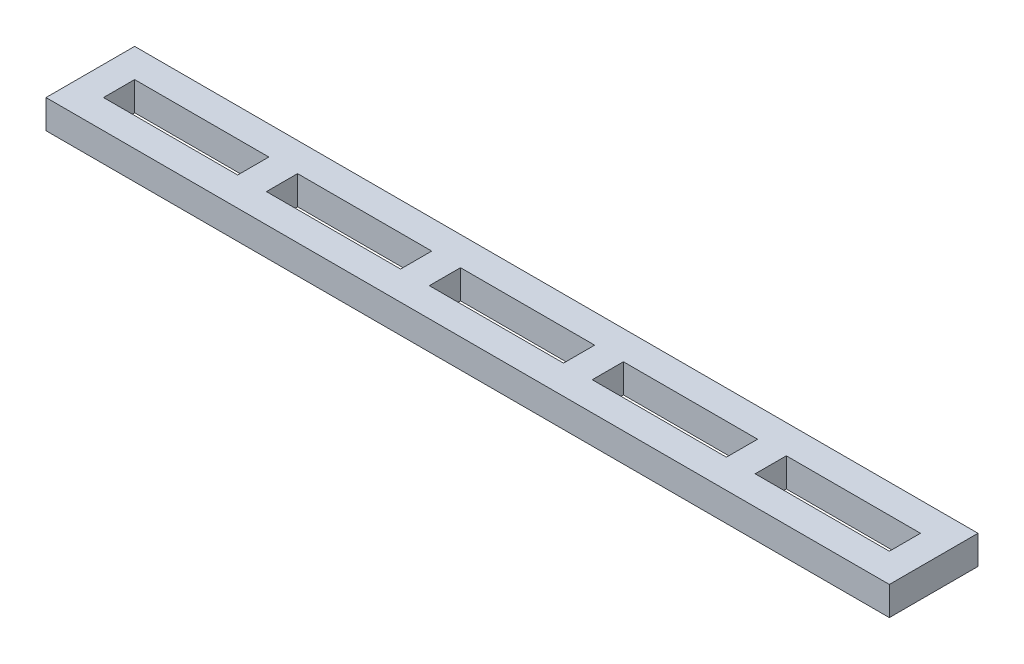
ISO-10303-21;
HEADER;
FILE_DESCRIPTION(('STEP AP214'),'2;1');
FILE_NAME('part.step','',(''),(''),'','','');
FILE_SCHEMA(('AUTOMOTIVE_DESIGN { 1 0 10303 214 1 1 1 1 }'));
ENDSEC;
DATA;
#1=APPLICATION_CONTEXT('core data for automotive mechanical design processes');
#2=APPLICATION_PROTOCOL_DEFINITION('international standard','automotive_design',2000,#1);
#3=PRODUCT_CONTEXT('',#1,'mechanical');
#4=PRODUCT('Part','Part','',(#3));
#5=PRODUCT_RELATED_PRODUCT_CATEGORY('part','',(#4));
#6=PRODUCT_DEFINITION_FORMATION('','',#4);
#7=PRODUCT_DEFINITION_CONTEXT('part definition',#1,'design');
#8=PRODUCT_DEFINITION('design','',#6,#7);
#9=PRODUCT_DEFINITION_SHAPE('','',#8);
#10=(LENGTH_UNIT() NAMED_UNIT(*) SI_UNIT(.MILLI.,.METRE.));
#11=(NAMED_UNIT(*) PLANE_ANGLE_UNIT() SI_UNIT($,.RADIAN.));
#12=(NAMED_UNIT(*) SI_UNIT($,.STERADIAN.) SOLID_ANGLE_UNIT());
#13=UNCERTAINTY_MEASURE_WITH_UNIT(LENGTH_MEASURE(1.E-05),#10,'distance_accuracy_value','');
#14=(GEOMETRIC_REPRESENTATION_CONTEXT(3) GLOBAL_UNCERTAINTY_ASSIGNED_CONTEXT((#13)) GLOBAL_UNIT_ASSIGNED_CONTEXT((#10,
#11,#12)) REPRESENTATION_CONTEXT('',''));
#15=CARTESIAN_POINT('',(0.,0.,0.));
#16=DIRECTION('',(0.,0.,1.));
#17=DIRECTION('',(1.,0.,0.));
#18=AXIS2_PLACEMENT_3D('',#15,#16,#17);
#19=CARTESIAN_POINT('',(279.4,-9.525,-29.36875));
#20=DIRECTION('',(0.,0.,1.));
#21=DIRECTION('',(1.,0.,0.));
#22=AXIS2_PLACEMENT_3D('',#19,#20,#21);
#23=PLANE('',#22);
#24=DIRECTION('',(0.,1.,0.));
#25=VECTOR('',#24,1.);
#26=CARTESIAN_POINT('',(-279.4,-9.525,-29.36875));
#27=LINE('',#26,#25);
#28=CARTESIAN_POINT('',(-279.4,-9.525,-29.36875));
#29=VERTEX_POINT('',#28);
#30=CARTESIAN_POINT('',(-279.4,9.525,-29.36875));
#31=VERTEX_POINT('',#30);
#32=EDGE_CURVE('E426',#29,#31,#27,.T.);
#33=ORIENTED_EDGE('',*,*,#32,.T.);
#34=DIRECTION('',(-1.,0.,0.));
#35=VECTOR('',#34,1.);
#36=CARTESIAN_POINT('',(279.4,9.525,-29.36875));
#37=LINE('',#36,#35);
#38=CARTESIAN_POINT('',(279.4,9.525,-29.36875));
#39=VERTEX_POINT('',#38);
#40=EDGE_CURVE('E11',#39,#31,#37,.T.);
#41=ORIENTED_EDGE('',*,*,#40,.F.);
#42=DIRECTION('',(0.,1.,0.));
#43=VECTOR('',#42,1.);
#44=CARTESIAN_POINT('',(279.4,-9.525,-29.36875));
#45=LINE('',#44,#43);
#46=CARTESIAN_POINT('',(279.4,-9.525,-29.36875));
#47=VERTEX_POINT('',#46);
#48=EDGE_CURVE('E436',#47,#39,#45,.T.);
#49=ORIENTED_EDGE('',*,*,#48,.F.);
#50=DIRECTION('',(-1.,0.,0.));
#51=VECTOR('',#50,1.);
#52=CARTESIAN_POINT('',(279.4,-9.525,-29.36875));
#53=LINE('',#52,#51);
#54=EDGE_CURVE('E449',#47,#29,#53,.T.);
#55=ORIENTED_EDGE('',*,*,#54,.T.);
#56=EDGE_LOOP('',(#33,#41,#49,#55));
#57=FACE_BOUND('',#56,.T.);
#58=ADVANCED_FACE('F41',(#57),#23,.F.);
#59=CARTESIAN_POINT('',(279.4,9.525,29.36875));
#60=DIRECTION('',(0.,-1.,0.));
#61=DIRECTION('',(0.,0.,-1.));
#62=AXIS2_PLACEMENT_3D('',#59,#60,#61);
#63=PLANE('',#62);
#64=DIRECTION('',(1.,0.,0.));
#65=VECTOR('',#64,1.);
#66=CARTESIAN_POINT('',(63.5,9.525,10.31875));
#67=LINE('',#66,#65);
#68=CARTESIAN_POINT('',(63.5,9.525,10.31875));
#69=VERTEX_POINT('',#68);
#70=CARTESIAN_POINT('',(152.4,9.525,10.31875));
#71=VERTEX_POINT('',#70);
#72=EDGE_CURVE('E262',#69,#71,#67,.T.);
#73=ORIENTED_EDGE('',*,*,#72,.F.);
#74=DIRECTION('',(0.,0.,1.));
#75=VECTOR('',#74,1.);
#76=CARTESIAN_POINT('',(63.5,9.525,-10.31875));
#77=LINE('',#76,#75);
#78=CARTESIAN_POINT('',(63.5,9.525,-10.31875));
#79=VERTEX_POINT('',#78);
#80=EDGE_CURVE('E56',#79,#69,#77,.T.);
#81=ORIENTED_EDGE('',*,*,#80,.F.);
#82=DIRECTION('',(-1.,0.,0.));
#83=VECTOR('',#82,1.);
#84=CARTESIAN_POINT('',(63.5,9.525,-10.31875));
#85=LINE('',#84,#83);
#86=CARTESIAN_POINT('',(152.4,9.525,-10.31875));
#87=VERTEX_POINT('',#86);
#88=EDGE_CURVE('E249',#87,#79,#85,.T.);
#89=ORIENTED_EDGE('',*,*,#88,.F.);
#90=DIRECTION('',(0.,0.,-1.));
#91=VECTOR('',#90,1.);
#92=CARTESIAN_POINT('',(152.4,9.525,-10.31875));
#93=LINE('',#92,#91);
#94=EDGE_CURVE('E253',#71,#87,#93,.T.);
#95=ORIENTED_EDGE('',*,*,#94,.F.);
#96=EDGE_LOOP('',(#73,#81,#89,#95));
#97=FACE_BOUND('',#96,.T.);
#98=DIRECTION('',(1.,0.,0.));
#99=VECTOR('',#98,1.);
#100=CARTESIAN_POINT('',(-44.45,9.525,10.31875));
#101=LINE('',#100,#99);
#102=CARTESIAN_POINT('',(-44.45,9.525,10.31875));
#103=VERTEX_POINT('',#102);
#104=CARTESIAN_POINT('',(44.45,9.525,10.31875));
#105=VERTEX_POINT('',#104);
#106=EDGE_CURVE('E293',#103,#105,#101,.T.);
#107=ORIENTED_EDGE('',*,*,#106,.F.);
#108=DIRECTION('',(0.,0.,1.));
#109=VECTOR('',#108,1.);
#110=CARTESIAN_POINT('',(-44.45,9.525,-10.31875));
#111=LINE('',#110,#109);
#112=CARTESIAN_POINT('',(-44.45,9.525,-10.31875));
#113=VERTEX_POINT('',#112);
#114=EDGE_CURVE('E271',#113,#103,#111,.T.);
#115=ORIENTED_EDGE('',*,*,#114,.F.);
#116=DIRECTION('',(-1.,0.,0.));
#117=VECTOR('',#116,1.);
#118=CARTESIAN_POINT('',(-44.45,9.525,-10.31875));
#119=LINE('',#118,#117);
#120=CARTESIAN_POINT('',(44.45,9.525,-10.31875));
#121=VERTEX_POINT('',#120);
#122=EDGE_CURVE('E281',#121,#113,#119,.T.);
#123=ORIENTED_EDGE('',*,*,#122,.F.);
#124=DIRECTION('',(0.,0.,-1.));
#125=VECTOR('',#124,1.);
#126=CARTESIAN_POINT('',(44.45,9.525,-10.31875));
#127=LINE('',#126,#125);
#128=EDGE_CURVE('E296',#105,#121,#127,.T.);
#129=ORIENTED_EDGE('',*,*,#128,.F.);
#130=EDGE_LOOP('',(#107,#115,#123,#129));
#131=FACE_BOUND('',#130,.T.);
#132=DIRECTION('',(0.,0.,-1.));
#133=VECTOR('',#132,1.);
#134=CARTESIAN_POINT('',(260.35,9.525,-10.31875));
#135=LINE('',#134,#133);
#136=CARTESIAN_POINT('',(260.35,9.525,10.31875));
#137=VERTEX_POINT('',#136);
#138=CARTESIAN_POINT('',(260.35,9.525,-10.31875));
#139=VERTEX_POINT('',#138);
#140=EDGE_CURVE('E331',#137,#139,#135,.T.);
#141=ORIENTED_EDGE('',*,*,#140,.F.);
#142=DIRECTION('',(1.,0.,0.));
#143=VECTOR('',#142,1.);
#144=CARTESIAN_POINT('',(260.35,9.525,10.31875));
#145=LINE('',#144,#143);
#146=CARTESIAN_POINT('',(171.45,9.525,10.31875));
#147=VERTEX_POINT('',#146);
#148=EDGE_CURVE('E305',#147,#137,#145,.T.);
#149=ORIENTED_EDGE('',*,*,#148,.F.);
#150=DIRECTION('',(0.,0.,1.));
#151=VECTOR('',#150,1.);
#152=CARTESIAN_POINT('',(171.45,9.525,-10.31875));
#153=LINE('',#152,#151);
#154=CARTESIAN_POINT('',(171.45,9.525,-10.31875));
#155=VERTEX_POINT('',#154);
#156=EDGE_CURVE('E317',#155,#147,#153,.T.);
#157=ORIENTED_EDGE('',*,*,#156,.F.);
#158=DIRECTION('',(-1.,0.,0.));
#159=VECTOR('',#158,1.);
#160=CARTESIAN_POINT('',(260.35,9.525,-10.31875));
#161=LINE('',#160,#159);
#162=EDGE_CURVE('E334',#139,#155,#161,.T.);
#163=ORIENTED_EDGE('',*,*,#162,.F.);
#164=EDGE_LOOP('',(#141,#149,#157,#163));
#165=FACE_BOUND('',#164,.T.);
#166=DIRECTION('',(1.,0.,0.));
#167=VECTOR('',#166,1.);
#168=CARTESIAN_POINT('',(-152.4,9.525,10.31875));
#169=LINE('',#168,#167);
#170=CARTESIAN_POINT('',(-152.4,9.525,10.31875));
#171=VERTEX_POINT('',#170);
#172=CARTESIAN_POINT('',(-63.5,9.525,10.31875));
#173=VERTEX_POINT('',#172);
#174=EDGE_CURVE('E371',#171,#173,#169,.T.);
#175=ORIENTED_EDGE('',*,*,#174,.F.);
#176=DIRECTION('',(0.,0.,1.));
#177=VECTOR('',#176,1.);
#178=CARTESIAN_POINT('',(-152.4,9.525,-10.31875));
#179=LINE('',#178,#177);
#180=CARTESIAN_POINT('',(-152.4,9.525,-10.31875));
#181=VERTEX_POINT('',#180);
#182=EDGE_CURVE('E344',#181,#171,#179,.T.);
#183=ORIENTED_EDGE('',*,*,#182,.F.);
#184=DIRECTION('',(-1.,0.,0.));
#185=VECTOR('',#184,1.);
#186=CARTESIAN_POINT('',(-152.4,9.525,-10.31875));
#187=LINE('',#186,#185);
#188=CARTESIAN_POINT('',(-63.5,9.525,-10.31875));
#189=VERTEX_POINT('',#188);
#190=EDGE_CURVE('E357',#189,#181,#187,.T.);
#191=ORIENTED_EDGE('',*,*,#190,.F.);
#192=DIRECTION('',(0.,0.,-1.));
#193=VECTOR('',#192,1.);
#194=CARTESIAN_POINT('',(-63.5,9.525,-10.31875));
#195=LINE('',#194,#193);
#196=EDGE_CURVE('E375',#173,#189,#195,.T.);
#197=ORIENTED_EDGE('',*,*,#196,.F.);
#198=EDGE_LOOP('',(#175,#183,#191,#197));
#199=FACE_BOUND('',#198,.T.);
#200=DIRECTION('',(-1.,0.,0.));
#201=VECTOR('',#200,1.);
#202=CARTESIAN_POINT('',(-260.35,9.525,-10.31875));
#203=LINE('',#202,#201);
#204=CARTESIAN_POINT('',(-171.45,9.525,-10.31875));
#205=VERTEX_POINT('',#204);
#206=CARTESIAN_POINT('',(-260.35,9.525,-10.31875));
#207=VERTEX_POINT('',#206);
#208=EDGE_CURVE('E412',#205,#207,#203,.T.);
#209=ORIENTED_EDGE('',*,*,#208,.F.);
#210=DIRECTION('',(0.,0.,-1.));
#211=VECTOR('',#210,1.);
#212=CARTESIAN_POINT('',(-171.45,9.525,-10.31875));
#213=LINE('',#212,#211);
#214=CARTESIAN_POINT('',(-171.45,9.525,10.31875));
#215=VERTEX_POINT('',#214);
#216=EDGE_CURVE('E384',#215,#205,#213,.T.);
#217=ORIENTED_EDGE('',*,*,#216,.F.);
#218=DIRECTION('',(1.,0.,0.));
#219=VECTOR('',#218,1.);
#220=CARTESIAN_POINT('',(-260.35,9.525,10.31875));
#221=LINE('',#220,#219);
#222=CARTESIAN_POINT('',(-260.35,9.525,10.31875));
#223=VERTEX_POINT('',#222);
#224=EDGE_CURVE('E397',#223,#215,#221,.T.);
#225=ORIENTED_EDGE('',*,*,#224,.F.);
#226=DIRECTION('',(0.,0.,1.));
#227=VECTOR('',#226,1.);
#228=CARTESIAN_POINT('',(-260.35,9.525,-10.31875));
#229=LINE('',#228,#227);
#230=EDGE_CURVE('E416',#207,#223,#229,.T.);
#231=ORIENTED_EDGE('',*,*,#230,.F.);
#232=EDGE_LOOP('',(#209,#217,#225,#231));
#233=FACE_BOUND('',#232,.T.);
#234=DIRECTION('',(0.,0.,1.));
#235=VECTOR('',#234,1.);
#236=CARTESIAN_POINT('',(-279.4,9.525,29.36875));
#237=LINE('',#236,#235);
#238=CARTESIAN_POINT('',(-279.4,9.525,29.36875));
#239=VERTEX_POINT('',#238);
#240=EDGE_CURVE('E453',#31,#239,#237,.T.);
#241=ORIENTED_EDGE('',*,*,#240,.T.);
#242=DIRECTION('',(-1.,0.,0.));
#243=VECTOR('',#242,1.);
#244=CARTESIAN_POINT('',(279.4,9.525,29.36875));
#245=LINE('',#244,#243);
#246=CARTESIAN_POINT('',(279.4,9.525,29.36875));
#247=VERTEX_POINT('',#246);
#248=EDGE_CURVE('E49',#247,#239,#245,.T.);
#249=ORIENTED_EDGE('',*,*,#248,.F.);
#250=DIRECTION('',(0.,0.,1.));
#251=VECTOR('',#250,1.);
#252=CARTESIAN_POINT('',(279.4,9.525,29.36875));
#253=LINE('',#252,#251);
#254=EDGE_CURVE('E439',#39,#247,#253,.T.);
#255=ORIENTED_EDGE('',*,*,#254,.F.);
#256=ORIENTED_EDGE('',*,*,#40,.T.);
#257=EDGE_LOOP('',(#241,#249,#255,#256));
#258=FACE_BOUND('',#257,.T.);
#259=ADVANCED_FACE('F488',(#97,#131,#165,#199,#233,#258),#63,.F.);
#260=CARTESIAN_POINT('',(279.4,-9.525,29.36875));
#261=DIRECTION('',(0.,0.,-1.));
#262=DIRECTION('',(-1.,0.,0.));
#263=AXIS2_PLACEMENT_3D('',#260,#261,#262);
#264=PLANE('',#263);
#265=DIRECTION('',(0.,-1.,0.));
#266=VECTOR('',#265,1.);
#267=CARTESIAN_POINT('',(-279.4,-9.525,29.36875));
#268=LINE('',#267,#266);
#269=CARTESIAN_POINT('',(-279.4,-9.525,29.36875));
#270=VERTEX_POINT('',#269);
#271=EDGE_CURVE('E456',#239,#270,#268,.T.);
#272=ORIENTED_EDGE('',*,*,#271,.T.);
#273=DIRECTION('',(-1.,0.,0.));
#274=VECTOR('',#273,1.);
#275=CARTESIAN_POINT('',(279.4,-9.525,29.36875));
#276=LINE('',#275,#274);
#277=CARTESIAN_POINT('',(279.4,-9.525,29.36875));
#278=VERTEX_POINT('',#277);
#279=EDGE_CURVE('E464',#278,#270,#276,.T.);
#280=ORIENTED_EDGE('',*,*,#279,.F.);
#281=DIRECTION('',(0.,-1.,0.));
#282=VECTOR('',#281,1.);
#283=CARTESIAN_POINT('',(279.4,-9.525,29.36875));
#284=LINE('',#283,#282);
#285=EDGE_CURVE('E443',#247,#278,#284,.T.);
#286=ORIENTED_EDGE('',*,*,#285,.F.);
#287=ORIENTED_EDGE('',*,*,#248,.T.);
#288=EDGE_LOOP('',(#272,#280,#286,#287));
#289=FACE_BOUND('',#288,.T.);
#290=ADVANCED_FACE('F473',(#289),#264,.F.);
#291=CARTESIAN_POINT('',(279.4,-9.525,29.36875));
#292=DIRECTION('',(0.,1.,0.));
#293=DIRECTION('',(0.,0.,1.));
#294=AXIS2_PLACEMENT_3D('',#291,#292,#293);
#295=PLANE('',#294);
#296=DIRECTION('',(-1.,0.,0.));
#297=VECTOR('',#296,1.);
#298=CARTESIAN_POINT('',(63.5,-9.525,-10.31875));
#299=LINE('',#298,#297);
#300=CARTESIAN_POINT('',(152.4,-9.525,-10.31875));
#301=VERTEX_POINT('',#300);
#302=CARTESIAN_POINT('',(63.5,-9.525,-10.31875));
#303=VERTEX_POINT('',#302);
#304=EDGE_CURVE('E238',#301,#303,#299,.T.);
#305=ORIENTED_EDGE('',*,*,#304,.T.);
#306=DIRECTION('',(0.,0.,1.));
#307=VECTOR('',#306,1.);
#308=CARTESIAN_POINT('',(63.5,-9.525,-10.31875));
#309=LINE('',#308,#307);
#310=CARTESIAN_POINT('',(63.5,-9.525,10.31875));
#311=VERTEX_POINT('',#310);
#312=EDGE_CURVE('E232',#303,#311,#309,.T.);
#313=ORIENTED_EDGE('',*,*,#312,.T.);
#314=DIRECTION('',(1.,0.,0.));
#315=VECTOR('',#314,1.);
#316=CARTESIAN_POINT('',(63.5,-9.525,10.31875));
#317=LINE('',#316,#315);
#318=CARTESIAN_POINT('',(152.4,-9.525,10.31875));
#319=VERTEX_POINT('',#318);
#320=EDGE_CURVE('E241',#311,#319,#317,.T.);
#321=ORIENTED_EDGE('',*,*,#320,.T.);
#322=DIRECTION('',(0.,0.,-1.));
#323=VECTOR('',#322,1.);
#324=CARTESIAN_POINT('',(152.4,-9.525,-10.31875));
#325=LINE('',#324,#323);
#326=EDGE_CURVE('E67',#319,#301,#325,.T.);
#327=ORIENTED_EDGE('',*,*,#326,.T.);
#328=EDGE_LOOP('',(#305,#313,#321,#327));
#329=FACE_BOUND('',#328,.T.);
#330=DIRECTION('',(-1.,0.,0.));
#331=VECTOR('',#330,1.);
#332=CARTESIAN_POINT('',(-44.45,-9.525,-10.31875));
#333=LINE('',#332,#331);
#334=CARTESIAN_POINT('',(44.45,-9.525,-10.31875));
#335=VERTEX_POINT('',#334);
#336=CARTESIAN_POINT('',(-44.45,-9.525,-10.31875));
#337=VERTEX_POINT('',#336);
#338=EDGE_CURVE('E287',#335,#337,#333,.T.);
#339=ORIENTED_EDGE('',*,*,#338,.T.);
#340=DIRECTION('',(0.,0.,1.));
#341=VECTOR('',#340,1.);
#342=CARTESIAN_POINT('',(-44.45,-9.525,-10.31875));
#343=LINE('',#342,#341);
#344=CARTESIAN_POINT('',(-44.45,-9.525,10.31875));
#345=VERTEX_POINT('',#344);
#346=EDGE_CURVE('E277',#337,#345,#343,.T.);
#347=ORIENTED_EDGE('',*,*,#346,.T.);
#348=DIRECTION('',(1.,0.,0.));
#349=VECTOR('',#348,1.);
#350=CARTESIAN_POINT('',(-44.45,-9.525,10.31875));
#351=LINE('',#350,#349);
#352=CARTESIAN_POINT('',(44.45,-9.525,10.31875));
#353=VERTEX_POINT('',#352);
#354=EDGE_CURVE('E280',#345,#353,#351,.T.);
#355=ORIENTED_EDGE('',*,*,#354,.T.);
#356=DIRECTION('',(0.,0.,-1.));
#357=VECTOR('',#356,1.);
#358=CARTESIAN_POINT('',(44.45,-9.525,-10.31875));
#359=LINE('',#358,#357);
#360=EDGE_CURVE('E284',#353,#335,#359,.T.);
#361=ORIENTED_EDGE('',*,*,#360,.T.);
#362=EDGE_LOOP('',(#339,#347,#355,#361));
#363=FACE_BOUND('',#362,.T.);
#364=DIRECTION('',(0.,0.,1.));
#365=VECTOR('',#364,1.);
#366=CARTESIAN_POINT('',(171.45,-9.525,-10.31875));
#367=LINE('',#366,#365);
#368=CARTESIAN_POINT('',(171.45,-9.525,-10.31875));
#369=VERTEX_POINT('',#368);
#370=CARTESIAN_POINT('',(171.45,-9.525,10.31875));
#371=VERTEX_POINT('',#370);
#372=EDGE_CURVE('E324',#369,#371,#367,.T.);
#373=ORIENTED_EDGE('',*,*,#372,.T.);
#374=DIRECTION('',(1.,0.,0.));
#375=VECTOR('',#374,1.);
#376=CARTESIAN_POINT('',(260.35,-9.525,10.31875));
#377=LINE('',#376,#375);
#378=CARTESIAN_POINT('',(260.35,-9.525,10.31875));
#379=VERTEX_POINT('',#378);
#380=EDGE_CURVE('E312',#371,#379,#377,.T.);
#381=ORIENTED_EDGE('',*,*,#380,.T.);
#382=DIRECTION('',(0.,0.,-1.));
#383=VECTOR('',#382,1.);
#384=CARTESIAN_POINT('',(260.35,-9.525,-10.31875));
#385=LINE('',#384,#383);
#386=CARTESIAN_POINT('',(260.35,-9.525,-10.31875));
#387=VERTEX_POINT('',#386);
#388=EDGE_CURVE('E316',#379,#387,#385,.T.);
#389=ORIENTED_EDGE('',*,*,#388,.T.);
#390=DIRECTION('',(-1.,0.,0.));
#391=VECTOR('',#390,1.);
#392=CARTESIAN_POINT('',(260.35,-9.525,-10.31875));
#393=LINE('',#392,#391);
#394=EDGE_CURVE('E320',#387,#369,#393,.T.);
#395=ORIENTED_EDGE('',*,*,#394,.T.);
#396=EDGE_LOOP('',(#373,#381,#389,#395));
#397=FACE_BOUND('',#396,.T.);
#398=DIRECTION('',(-1.,0.,0.));
#399=VECTOR('',#398,1.);
#400=CARTESIAN_POINT('',(-152.4,-9.525,-10.31875));
#401=LINE('',#400,#399);
#402=CARTESIAN_POINT('',(-63.5,-9.525,-10.31875));
#403=VERTEX_POINT('',#402);
#404=CARTESIAN_POINT('',(-152.4,-9.525,-10.31875));
#405=VERTEX_POINT('',#404);
#406=EDGE_CURVE('E364',#403,#405,#401,.T.);
#407=ORIENTED_EDGE('',*,*,#406,.T.);
#408=DIRECTION('',(0.,0.,1.));
#409=VECTOR('',#408,1.);
#410=CARTESIAN_POINT('',(-152.4,-9.525,-10.31875));
#411=LINE('',#410,#409);
#412=CARTESIAN_POINT('',(-152.4,-9.525,10.31875));
#413=VERTEX_POINT('',#412);
#414=EDGE_CURVE('E352',#405,#413,#411,.T.);
#415=ORIENTED_EDGE('',*,*,#414,.T.);
#416=DIRECTION('',(1.,0.,0.));
#417=VECTOR('',#416,1.);
#418=CARTESIAN_POINT('',(-152.4,-9.525,10.31875));
#419=LINE('',#418,#417);
#420=CARTESIAN_POINT('',(-63.4999999999999,-9.525,10.31875));
#421=VERTEX_POINT('',#420);
#422=EDGE_CURVE('E356',#413,#421,#419,.T.);
#423=ORIENTED_EDGE('',*,*,#422,.T.);
#424=DIRECTION('',(0.,0.,-1.));
#425=VECTOR('',#424,1.);
#426=CARTESIAN_POINT('',(-63.5,-9.525,-10.31875));
#427=LINE('',#426,#425);
#428=EDGE_CURVE('E361',#421,#403,#427,.T.);
#429=ORIENTED_EDGE('',*,*,#428,.T.);
#430=EDGE_LOOP('',(#407,#415,#423,#429));
#431=FACE_BOUND('',#430,.T.);
#432=DIRECTION('',(1.,0.,0.));
#433=VECTOR('',#432,1.);
#434=CARTESIAN_POINT('',(-260.35,-9.525,10.31875));
#435=LINE('',#434,#433);
#436=CARTESIAN_POINT('',(-260.35,-9.525,10.31875));
#437=VERTEX_POINT('',#436);
#438=CARTESIAN_POINT('',(-171.45,-9.525,10.31875));
#439=VERTEX_POINT('',#438);
#440=EDGE_CURVE('E405',#437,#439,#435,.T.);
#441=ORIENTED_EDGE('',*,*,#440,.T.);
#442=DIRECTION('',(0.,0.,-1.));
#443=VECTOR('',#442,1.);
#444=CARTESIAN_POINT('',(-171.45,-9.525,-10.31875));
#445=LINE('',#444,#443);
#446=CARTESIAN_POINT('',(-171.45,-9.525,-10.31875));
#447=VERTEX_POINT('',#446);
#448=EDGE_CURVE('E392',#439,#447,#445,.T.);
#449=ORIENTED_EDGE('',*,*,#448,.T.);
#450=DIRECTION('',(-1.,0.,0.));
#451=VECTOR('',#450,1.);
#452=CARTESIAN_POINT('',(-260.35,-9.525,-10.31875));
#453=LINE('',#452,#451);
#454=CARTESIAN_POINT('',(-260.35,-9.525,-10.31875));
#455=VERTEX_POINT('',#454);
#456=EDGE_CURVE('E396',#447,#455,#453,.T.);
#457=ORIENTED_EDGE('',*,*,#456,.T.);
#458=DIRECTION('',(0.,0.,1.));
#459=VECTOR('',#458,1.);
#460=CARTESIAN_POINT('',(-260.35,-9.525,-10.31875));
#461=LINE('',#460,#459);
#462=EDGE_CURVE('E401',#455,#437,#461,.T.);
#463=ORIENTED_EDGE('',*,*,#462,.T.);
#464=EDGE_LOOP('',(#441,#449,#457,#463));
#465=FACE_BOUND('',#464,.T.);
#466=DIRECTION('',(0.,0.,-1.));
#467=VECTOR('',#466,1.);
#468=CARTESIAN_POINT('',(-279.4,-9.525,29.36875));
#469=LINE('',#468,#467);
#470=EDGE_CURVE('E440',#270,#29,#469,.T.);
#471=ORIENTED_EDGE('',*,*,#470,.T.);
#472=ORIENTED_EDGE('',*,*,#54,.F.);
#473=DIRECTION('',(0.,0.,-1.));
#474=VECTOR('',#473,1.);
#475=CARTESIAN_POINT('',(279.4,-9.525,29.36875));
#476=LINE('',#475,#474);
#477=EDGE_CURVE('E446',#278,#47,#476,.T.);
#478=ORIENTED_EDGE('',*,*,#477,.F.);
#479=ORIENTED_EDGE('',*,*,#279,.T.);
#480=EDGE_LOOP('',(#471,#472,#478,#479));
#481=FACE_BOUND('',#480,.T.);
#482=ADVANCED_FACE('F246',(#329,#363,#397,#431,#465,#481),#295,.F.);
#483=CARTESIAN_POINT('',(279.4,0.,0.));
#484=DIRECTION('',(-1.,0.,0.));
#485=DIRECTION('',(0.,0.,1.));
#486=AXIS2_PLACEMENT_3D('',#483,#484,#485);
#487=PLANE('',#486);
#488=ORIENTED_EDGE('',*,*,#48,.T.);
#489=ORIENTED_EDGE('',*,*,#254,.T.);
#490=ORIENTED_EDGE('',*,*,#285,.T.);
#491=ORIENTED_EDGE('',*,*,#477,.T.);
#492=EDGE_LOOP('',(#488,#489,#490,#491));
#493=FACE_BOUND('',#492,.T.);
#494=ADVANCED_FACE('F487',(#493),#487,.F.);
#495=CARTESIAN_POINT('',(-279.4,0.,0.));
#496=DIRECTION('',(-1.,0.,0.));
#497=DIRECTION('',(0.,0.,1.));
#498=AXIS2_PLACEMENT_3D('',#495,#496,#497);
#499=PLANE('',#498);
#500=ORIENTED_EDGE('',*,*,#32,.F.);
#501=ORIENTED_EDGE('',*,*,#470,.F.);
#502=ORIENTED_EDGE('',*,*,#271,.F.);
#503=ORIENTED_EDGE('',*,*,#240,.F.);
#504=EDGE_LOOP('',(#500,#501,#502,#503));
#505=FACE_BOUND('',#504,.T.);
#506=ADVANCED_FACE('F479',(#505),#499,.T.);
#507=CARTESIAN_POINT('',(-171.45,-9.525,-10.31875));
#508=DIRECTION('',(1.,0.,0.));
#509=DIRECTION('',(0.,0.,-1.));
#510=AXIS2_PLACEMENT_3D('',#507,#508,#509);
#511=PLANE('',#510);
#512=ORIENTED_EDGE('',*,*,#216,.T.);
#513=DIRECTION('',(0.,1.,0.));
#514=VECTOR('',#513,1.);
#515=CARTESIAN_POINT('',(-171.45,-9.525,-10.31875));
#516=LINE('',#515,#514);
#517=EDGE_CURVE('E409',#447,#205,#516,.T.);
#518=ORIENTED_EDGE('',*,*,#517,.F.);
#519=ORIENTED_EDGE('',*,*,#448,.F.);
#520=DIRECTION('',(0.,1.,0.));
#521=VECTOR('',#520,1.);
#522=CARTESIAN_POINT('',(-171.45,-9.525,10.31875));
#523=LINE('',#522,#521);
#524=EDGE_CURVE('E423',#439,#215,#523,.T.);
#525=ORIENTED_EDGE('',*,*,#524,.T.);
#526=EDGE_LOOP('',(#512,#518,#519,#525));
#527=FACE_BOUND('',#526,.T.);
#528=ADVANCED_FACE('F502',(#527),#511,.F.);
#529=CARTESIAN_POINT('',(-260.35,-9.525,10.31875));
#530=DIRECTION('',(0.,0.,1.));
#531=DIRECTION('',(1.,0.,0.));
#532=AXIS2_PLACEMENT_3D('',#529,#530,#531);
#533=PLANE('',#532);
#534=ORIENTED_EDGE('',*,*,#224,.T.);
#535=ORIENTED_EDGE('',*,*,#524,.F.);
#536=ORIENTED_EDGE('',*,*,#440,.F.);
#537=DIRECTION('',(0.,1.,0.));
#538=VECTOR('',#537,1.);
#539=CARTESIAN_POINT('',(-260.35,-9.525,10.31875));
#540=LINE('',#539,#538);
#541=EDGE_CURVE('E427',#437,#223,#540,.T.);
#542=ORIENTED_EDGE('',*,*,#541,.T.);
#543=EDGE_LOOP('',(#534,#535,#536,#542));
#544=FACE_BOUND('',#543,.T.);
#545=ADVANCED_FACE('F507',(#544),#533,.F.);
#546=CARTESIAN_POINT('',(-260.35,-9.525,-10.31875));
#547=DIRECTION('',(-1.,0.,0.));
#548=DIRECTION('',(0.,0.,1.));
#549=AXIS2_PLACEMENT_3D('',#546,#547,#548);
#550=PLANE('',#549);
#551=ORIENTED_EDGE('',*,*,#230,.T.);
#552=ORIENTED_EDGE('',*,*,#541,.F.);
#553=ORIENTED_EDGE('',*,*,#462,.F.);
#554=DIRECTION('',(0.,1.,0.));
#555=VECTOR('',#554,1.);
#556=CARTESIAN_POINT('',(-260.35,-9.525,-10.31875));
#557=LINE('',#556,#555);
#558=EDGE_CURVE('E430',#455,#207,#557,.T.);
#559=ORIENTED_EDGE('',*,*,#558,.T.);
#560=EDGE_LOOP('',(#551,#552,#553,#559));
#561=FACE_BOUND('',#560,.T.);
#562=ADVANCED_FACE('F513',(#561),#550,.F.);
#563=CARTESIAN_POINT('',(-260.35,-9.525,-10.31875));
#564=DIRECTION('',(0.,0.,-1.));
#565=DIRECTION('',(-1.,0.,0.));
#566=AXIS2_PLACEMENT_3D('',#563,#564,#565);
#567=PLANE('',#566);
#568=ORIENTED_EDGE('',*,*,#208,.T.);
#569=ORIENTED_EDGE('',*,*,#558,.F.);
#570=ORIENTED_EDGE('',*,*,#456,.F.);
#571=ORIENTED_EDGE('',*,*,#517,.T.);
#572=EDGE_LOOP('',(#568,#569,#570,#571));
#573=FACE_BOUND('',#572,.T.);
#574=ADVANCED_FACE('F509',(#573),#567,.F.);
#575=CARTESIAN_POINT('',(-152.4,-9.525,-10.31875));
#576=DIRECTION('',(-1.,0.,0.));
#577=DIRECTION('',(0.,0.,1.));
#578=AXIS2_PLACEMENT_3D('',#575,#576,#577);
#579=PLANE('',#578);
#580=ORIENTED_EDGE('',*,*,#182,.T.);
#581=DIRECTION('',(0.,1.,0.));
#582=VECTOR('',#581,1.);
#583=CARTESIAN_POINT('',(-152.4,-9.525,10.31875));
#584=LINE('',#583,#582);
#585=EDGE_CURVE('E368',#413,#171,#584,.T.);
#586=ORIENTED_EDGE('',*,*,#585,.F.);
#587=ORIENTED_EDGE('',*,*,#414,.F.);
#588=DIRECTION('',(0.,1.,0.));
#589=VECTOR('',#588,1.);
#590=CARTESIAN_POINT('',(-152.4,-9.525,-10.31875));
#591=LINE('',#590,#589);
#592=EDGE_CURVE('E381',#405,#181,#591,.T.);
#593=ORIENTED_EDGE('',*,*,#592,.T.);
#594=EDGE_LOOP('',(#580,#586,#587,#593));
#595=FACE_BOUND('',#594,.T.);
#596=ADVANCED_FACE('F512',(#595),#579,.F.);
#597=CARTESIAN_POINT('',(-152.4,-9.525,-10.31875));
#598=DIRECTION('',(0.,0.,-1.));
#599=DIRECTION('',(-1.,0.,0.));
#600=AXIS2_PLACEMENT_3D('',#597,#598,#599);
#601=PLANE('',#600);
#602=ORIENTED_EDGE('',*,*,#190,.T.);
#603=ORIENTED_EDGE('',*,*,#592,.F.);
#604=ORIENTED_EDGE('',*,*,#406,.F.);
#605=DIRECTION('',(0.,1.,0.));
#606=VECTOR('',#605,1.);
#607=CARTESIAN_POINT('',(-63.5,-9.525,-10.31875));
#608=LINE('',#607,#606);
#609=EDGE_CURVE('E385',#403,#189,#608,.T.);
#610=ORIENTED_EDGE('',*,*,#609,.T.);
#611=EDGE_LOOP('',(#602,#603,#604,#610));
#612=FACE_BOUND('',#611,.T.);
#613=ADVANCED_FACE('F523',(#612),#601,.F.);
#614=CARTESIAN_POINT('',(-63.5,-9.525,-10.31875));
#615=DIRECTION('',(1.,0.,0.));
#616=DIRECTION('',(0.,0.,-1.));
#617=AXIS2_PLACEMENT_3D('',#614,#615,#616);
#618=PLANE('',#617);
#619=ORIENTED_EDGE('',*,*,#196,.T.);
#620=ORIENTED_EDGE('',*,*,#609,.F.);
#621=ORIENTED_EDGE('',*,*,#428,.F.);
#622=DIRECTION('',(0.,1.,0.));
#623=VECTOR('',#622,1.);
#624=CARTESIAN_POINT('',(-63.5,-9.525,10.31875));
#625=LINE('',#624,#623);
#626=EDGE_CURVE('E387',#421,#173,#625,.T.);
#627=ORIENTED_EDGE('',*,*,#626,.T.);
#628=EDGE_LOOP('',(#619,#620,#621,#627));
#629=FACE_BOUND('',#628,.T.);
#630=ADVANCED_FACE('F529',(#629),#618,.F.);
#631=CARTESIAN_POINT('',(-152.4,-9.525,10.31875));
#632=DIRECTION('',(0.,0.,1.));
#633=DIRECTION('',(1.,0.,0.));
#634=AXIS2_PLACEMENT_3D('',#631,#632,#633);
#635=PLANE('',#634);
#636=ORIENTED_EDGE('',*,*,#174,.T.);
#637=ORIENTED_EDGE('',*,*,#626,.F.);
#638=ORIENTED_EDGE('',*,*,#422,.F.);
#639=ORIENTED_EDGE('',*,*,#585,.T.);
#640=EDGE_LOOP('',(#636,#637,#638,#639));
#641=FACE_BOUND('',#640,.T.);
#642=ADVANCED_FACE('F525',(#641),#635,.F.);
#643=CARTESIAN_POINT('',(260.35,-9.525,10.31875));
#644=DIRECTION('',(0.,0.,1.));
#645=DIRECTION('',(1.,0.,0.));
#646=AXIS2_PLACEMENT_3D('',#643,#644,#645);
#647=PLANE('',#646);
#648=ORIENTED_EDGE('',*,*,#148,.T.);
#649=DIRECTION('',(0.,1.,0.));
#650=VECTOR('',#649,1.);
#651=CARTESIAN_POINT('',(260.35,-9.525,10.31875));
#652=LINE('',#651,#650);
#653=EDGE_CURVE('E328',#379,#137,#652,.T.);
#654=ORIENTED_EDGE('',*,*,#653,.F.);
#655=ORIENTED_EDGE('',*,*,#380,.F.);
#656=DIRECTION('',(0.,1.,0.));
#657=VECTOR('',#656,1.);
#658=CARTESIAN_POINT('',(171.45,-9.525,10.31875));
#659=LINE('',#658,#657);
#660=EDGE_CURVE('E341',#371,#147,#659,.T.);
#661=ORIENTED_EDGE('',*,*,#660,.T.);
#662=EDGE_LOOP('',(#648,#654,#655,#661));
#663=FACE_BOUND('',#662,.T.);
#664=ADVANCED_FACE('F528',(#663),#647,.F.);
#665=CARTESIAN_POINT('',(171.45,-9.525,-10.31875));
#666=DIRECTION('',(-1.,0.,0.));
#667=DIRECTION('',(0.,0.,1.));
#668=AXIS2_PLACEMENT_3D('',#665,#666,#667);
#669=PLANE('',#668);
#670=ORIENTED_EDGE('',*,*,#156,.T.);
#671=ORIENTED_EDGE('',*,*,#660,.F.);
#672=ORIENTED_EDGE('',*,*,#372,.F.);
#673=DIRECTION('',(0.,1.,0.));
#674=VECTOR('',#673,1.);
#675=CARTESIAN_POINT('',(171.45,-9.525,-10.31875));
#676=LINE('',#675,#674);
#677=EDGE_CURVE('E345',#369,#155,#676,.T.);
#678=ORIENTED_EDGE('',*,*,#677,.T.);
#679=EDGE_LOOP('',(#670,#671,#672,#678));
#680=FACE_BOUND('',#679,.T.);
#681=ADVANCED_FACE('F539',(#680),#669,.F.);
#682=CARTESIAN_POINT('',(260.35,-9.525,-10.31875));
#683=DIRECTION('',(0.,0.,-1.));
#684=DIRECTION('',(-1.,0.,0.));
#685=AXIS2_PLACEMENT_3D('',#682,#683,#684);
#686=PLANE('',#685);
#687=ORIENTED_EDGE('',*,*,#162,.T.);
#688=ORIENTED_EDGE('',*,*,#677,.F.);
#689=ORIENTED_EDGE('',*,*,#394,.F.);
#690=DIRECTION('',(0.,1.,0.));
#691=VECTOR('',#690,1.);
#692=CARTESIAN_POINT('',(260.35,-9.525,-10.31875));
#693=LINE('',#692,#691);
#694=EDGE_CURVE('E348',#387,#139,#693,.T.);
#695=ORIENTED_EDGE('',*,*,#694,.T.);
#696=EDGE_LOOP('',(#687,#688,#689,#695));
#697=FACE_BOUND('',#696,.T.);
#698=ADVANCED_FACE('F545',(#697),#686,.F.);
#699=CARTESIAN_POINT('',(260.35,-9.525,-10.31875));
#700=DIRECTION('',(1.,0.,0.));
#701=DIRECTION('',(0.,0.,-1.));
#702=AXIS2_PLACEMENT_3D('',#699,#700,#701);
#703=PLANE('',#702);
#704=ORIENTED_EDGE('',*,*,#140,.T.);
#705=ORIENTED_EDGE('',*,*,#694,.F.);
#706=ORIENTED_EDGE('',*,*,#388,.F.);
#707=ORIENTED_EDGE('',*,*,#653,.T.);
#708=EDGE_LOOP('',(#704,#705,#706,#707));
#709=FACE_BOUND('',#708,.T.);
#710=ADVANCED_FACE('F541',(#709),#703,.F.);
#711=CARTESIAN_POINT('',(-44.45,-9.525,-10.31875));
#712=DIRECTION('',(-1.,0.,0.));
#713=DIRECTION('',(0.,0.,1.));
#714=AXIS2_PLACEMENT_3D('',#711,#712,#713);
#715=PLANE('',#714);
#716=ORIENTED_EDGE('',*,*,#114,.T.);
#717=DIRECTION('',(0.,1.,0.));
#718=VECTOR('',#717,1.);
#719=CARTESIAN_POINT('',(-44.45,-9.525,10.31875));
#720=LINE('',#719,#718);
#721=EDGE_CURVE('E290',#345,#103,#720,.T.);
#722=ORIENTED_EDGE('',*,*,#721,.F.);
#723=ORIENTED_EDGE('',*,*,#346,.F.);
#724=DIRECTION('',(0.,1.,0.));
#725=VECTOR('',#724,1.);
#726=CARTESIAN_POINT('',(-44.45,-9.525,-10.31875));
#727=LINE('',#726,#725);
#728=EDGE_CURVE('E302',#337,#113,#727,.T.);
#729=ORIENTED_EDGE('',*,*,#728,.T.);
#730=EDGE_LOOP('',(#716,#722,#723,#729));
#731=FACE_BOUND('',#730,.T.);
#732=ADVANCED_FACE('F544',(#731),#715,.F.);
#733=CARTESIAN_POINT('',(-44.45,-9.525,-10.31875));
#734=DIRECTION('',(0.,0.,-1.));
#735=DIRECTION('',(-1.,0.,0.));
#736=AXIS2_PLACEMENT_3D('',#733,#734,#735);
#737=PLANE('',#736);
#738=ORIENTED_EDGE('',*,*,#122,.T.);
#739=ORIENTED_EDGE('',*,*,#728,.F.);
#740=ORIENTED_EDGE('',*,*,#338,.F.);
#741=DIRECTION('',(0.,1.,0.));
#742=VECTOR('',#741,1.);
#743=CARTESIAN_POINT('',(44.45,-9.525,-10.31875));
#744=LINE('',#743,#742);
#745=EDGE_CURVE('E306',#335,#121,#744,.T.);
#746=ORIENTED_EDGE('',*,*,#745,.T.);
#747=EDGE_LOOP('',(#738,#739,#740,#746));
#748=FACE_BOUND('',#747,.T.);
#749=ADVANCED_FACE('F555',(#748),#737,.F.);
#750=CARTESIAN_POINT('',(44.45,-9.525,-10.31875));
#751=DIRECTION('',(1.,0.,0.));
#752=DIRECTION('',(0.,0.,-1.));
#753=AXIS2_PLACEMENT_3D('',#750,#751,#752);
#754=PLANE('',#753);
#755=ORIENTED_EDGE('',*,*,#128,.T.);
#756=ORIENTED_EDGE('',*,*,#745,.F.);
#757=ORIENTED_EDGE('',*,*,#360,.F.);
#758=DIRECTION('',(0.,1.,0.));
#759=VECTOR('',#758,1.);
#760=CARTESIAN_POINT('',(44.45,-9.525,10.31875));
#761=LINE('',#760,#759);
#762=EDGE_CURVE('E308',#353,#105,#761,.T.);
#763=ORIENTED_EDGE('',*,*,#762,.T.);
#764=EDGE_LOOP('',(#755,#756,#757,#763));
#765=FACE_BOUND('',#764,.T.);
#766=ADVANCED_FACE('F560',(#765),#754,.F.);
#767=CARTESIAN_POINT('',(-44.45,-9.525,10.31875));
#768=DIRECTION('',(0.,0.,1.));
#769=DIRECTION('',(1.,0.,0.));
#770=AXIS2_PLACEMENT_3D('',#767,#768,#769);
#771=PLANE('',#770);
#772=ORIENTED_EDGE('',*,*,#106,.T.);
#773=ORIENTED_EDGE('',*,*,#762,.F.);
#774=ORIENTED_EDGE('',*,*,#354,.F.);
#775=ORIENTED_EDGE('',*,*,#721,.T.);
#776=EDGE_LOOP('',(#772,#773,#774,#775));
#777=FACE_BOUND('',#776,.T.);
#778=ADVANCED_FACE('F557',(#777),#771,.F.);
#779=CARTESIAN_POINT('',(63.5,-9.525,-10.31875));
#780=DIRECTION('',(-1.,0.,0.));
#781=DIRECTION('',(0.,0.,1.));
#782=AXIS2_PLACEMENT_3D('',#779,#780,#781);
#783=PLANE('',#782);
#784=ORIENTED_EDGE('',*,*,#80,.T.);
#785=DIRECTION('',(0.,1.,0.));
#786=VECTOR('',#785,1.);
#787=CARTESIAN_POINT('',(63.5,-9.525,10.31875));
#788=LINE('',#787,#786);
#789=EDGE_CURVE('E228',#311,#69,#788,.T.);
#790=ORIENTED_EDGE('',*,*,#789,.F.);
#791=ORIENTED_EDGE('',*,*,#312,.F.);
#792=DIRECTION('',(0.,1.,0.));
#793=VECTOR('',#792,1.);
#794=CARTESIAN_POINT('',(63.5,-9.525,-10.31875));
#795=LINE('',#794,#793);
#796=EDGE_CURVE('E268',#303,#79,#795,.T.);
#797=ORIENTED_EDGE('',*,*,#796,.T.);
#798=EDGE_LOOP('',(#784,#790,#791,#797));
#799=FACE_BOUND('',#798,.T.);
#800=ADVANCED_FACE('F230',(#799),#783,.F.);
#801=CARTESIAN_POINT('',(63.5,-9.525,-10.31875));
#802=DIRECTION('',(0.,0.,-1.));
#803=DIRECTION('',(-1.,0.,0.));
#804=AXIS2_PLACEMENT_3D('',#801,#802,#803);
#805=PLANE('',#804);
#806=ORIENTED_EDGE('',*,*,#88,.T.);
#807=ORIENTED_EDGE('',*,*,#796,.F.);
#808=ORIENTED_EDGE('',*,*,#304,.F.);
#809=DIRECTION('',(0.,1.,0.));
#810=VECTOR('',#809,1.);
#811=CARTESIAN_POINT('',(152.4,-9.525,-10.31875));
#812=LINE('',#811,#810);
#813=EDGE_CURVE('E272',#301,#87,#812,.T.);
#814=ORIENTED_EDGE('',*,*,#813,.T.);
#815=EDGE_LOOP('',(#806,#807,#808,#814));
#816=FACE_BOUND('',#815,.T.);
#817=ADVANCED_FACE('F570',(#816),#805,.F.);
#818=CARTESIAN_POINT('',(152.4,-9.525,-10.31875));
#819=DIRECTION('',(1.,0.,0.));
#820=DIRECTION('',(0.,0.,-1.));
#821=AXIS2_PLACEMENT_3D('',#818,#819,#820);
#822=PLANE('',#821);
#823=ORIENTED_EDGE('',*,*,#94,.T.);
#824=ORIENTED_EDGE('',*,*,#813,.F.);
#825=ORIENTED_EDGE('',*,*,#326,.F.);
#826=DIRECTION('',(0.,1.,0.));
#827=VECTOR('',#826,1.);
#828=CARTESIAN_POINT('',(152.4,-9.525,10.31875));
#829=LINE('',#828,#827);
#830=EDGE_CURVE('E237',#319,#71,#829,.T.);
#831=ORIENTED_EDGE('',*,*,#830,.T.);
#832=EDGE_LOOP('',(#823,#824,#825,#831));
#833=FACE_BOUND('',#832,.T.);
#834=ADVANCED_FACE('F573',(#833),#822,.F.);
#835=CARTESIAN_POINT('',(63.5,-9.525,10.31875));
#836=DIRECTION('',(0.,0.,1.));
#837=DIRECTION('',(1.,0.,0.));
#838=AXIS2_PLACEMENT_3D('',#835,#836,#837);
#839=PLANE('',#838);
#840=ORIENTED_EDGE('',*,*,#72,.T.);
#841=ORIENTED_EDGE('',*,*,#830,.F.);
#842=ORIENTED_EDGE('',*,*,#320,.F.);
#843=ORIENTED_EDGE('',*,*,#789,.T.);
#844=EDGE_LOOP('',(#840,#841,#842,#843));
#845=FACE_BOUND('',#844,.T.);
#846=ADVANCED_FACE('F242',(#845),#839,.F.);
#847=CLOSED_SHELL('',(#58,#259,#290,#482,#494,#506,#528,#545,#562,#574,#596,#613,#630,#642,#664,
#681,#698,#710,#732,#749,#766,#778,#800,#817,#834,#846));
#848=MANIFOLD_SOLID_BREP('B2',#847);
#849=ADVANCED_BREP_SHAPE_REPRESENTATION('',(#18,#848),#14);
#850=SHAPE_DEFINITION_REPRESENTATION(#9,#849);
ENDSEC;
END-ISO-10303-21;
